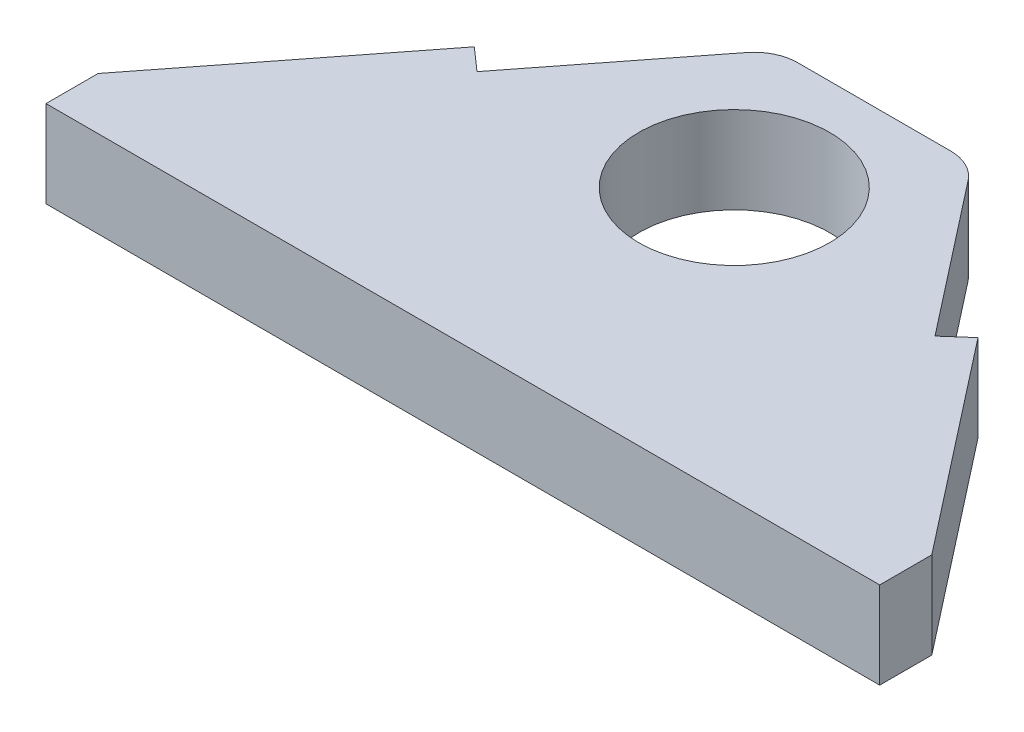
ISO-10303-21;
HEADER;
FILE_DESCRIPTION(('STEP AP214'),'2;1');
FILE_NAME('part.step','',(''),(''),'','','');
FILE_SCHEMA(('AUTOMOTIVE_DESIGN { 1 0 10303 214 1 1 1 1 }'));
ENDSEC;
DATA;
#1=APPLICATION_CONTEXT('core data for automotive mechanical design processes');
#2=APPLICATION_PROTOCOL_DEFINITION('international standard','automotive_design',2000,#1);
#3=PRODUCT_CONTEXT('',#1,'mechanical');
#4=PRODUCT('Part','Part','',(#3));
#5=PRODUCT_RELATED_PRODUCT_CATEGORY('part','',(#4));
#6=PRODUCT_DEFINITION_FORMATION('','',#4);
#7=PRODUCT_DEFINITION_CONTEXT('part definition',#1,'design');
#8=PRODUCT_DEFINITION('design','',#6,#7);
#9=PRODUCT_DEFINITION_SHAPE('','',#8);
#10=(LENGTH_UNIT() NAMED_UNIT(*) SI_UNIT(.MILLI.,.METRE.));
#11=(NAMED_UNIT(*) PLANE_ANGLE_UNIT() SI_UNIT($,.RADIAN.));
#12=(NAMED_UNIT(*) SI_UNIT($,.STERADIAN.) SOLID_ANGLE_UNIT());
#13=UNCERTAINTY_MEASURE_WITH_UNIT(LENGTH_MEASURE(1.E-05),#10,'distance_accuracy_value','');
#14=(GEOMETRIC_REPRESENTATION_CONTEXT(3) GLOBAL_UNCERTAINTY_ASSIGNED_CONTEXT((#13)) GLOBAL_UNIT_ASSIGNED_CONTEXT((#10,
#11,#12)) REPRESENTATION_CONTEXT('',''));
#15=CARTESIAN_POINT('',(0.,0.,0.));
#16=DIRECTION('',(0.,0.,1.));
#17=DIRECTION('',(1.,0.,0.));
#18=AXIS2_PLACEMENT_3D('',#15,#16,#17);
#19=CARTESIAN_POINT('',(17.6162885321092,20.,-22.2139984203571));
#20=DIRECTION('',(0.,-1.,0.));
#21=DIRECTION('',(0.,0.,-1.));
#22=AXIS2_PLACEMENT_3D('',#19,#20,#21);
#23=CYLINDRICAL_SURFACE('',#22,10.);
#24=CARTESIAN_POINT('',(17.6162885321092,0.,-22.2139984203571));
#25=DIRECTION('',(0.,1.,0.));
#26=DIRECTION('',(0.,0.,1.));
#27=AXIS2_PLACEMENT_3D('',#24,#25,#26);
#28=CIRCLE('',#27,10.);
#29=CARTESIAN_POINT('',(17.6162885321092,0.,-32.2139984203571));
#30=VERTEX_POINT('',#29);
#31=CARTESIAN_POINT('',(25.4963960681764,0.,-28.3706131736137));
#32=VERTEX_POINT('',#31);
#33=EDGE_CURVE('E161',#30,#32,#28,.F.);
#34=ORIENTED_EDGE('',*,*,#33,.F.);
#35=DIRECTION('',(0.,-1.,0.));
#36=VECTOR('',#35,1.);
#37=CARTESIAN_POINT('',(17.6162885321092,20.,-32.2139984203571));
#38=LINE('',#37,#36);
#39=CARTESIAN_POINT('',(17.6162885321092,20.,-32.2139984203571));
#40=VERTEX_POINT('',#39);
#41=EDGE_CURVE('E11',#40,#30,#38,.T.);
#42=ORIENTED_EDGE('',*,*,#41,.F.);
#43=CARTESIAN_POINT('',(17.6162885321092,20.,-22.2139984203571));
#44=DIRECTION('',(0.,1.,0.));
#45=DIRECTION('',(0.,0.,1.));
#46=AXIS2_PLACEMENT_3D('',#43,#44,#45);
#47=CIRCLE('',#46,10.);
#48=CARTESIAN_POINT('',(25.4963960681764,20.,-28.3706131736137));
#49=VERTEX_POINT('',#48);
#50=EDGE_CURVE('E193',#40,#49,#47,.F.);
#51=ORIENTED_EDGE('',*,*,#50,.T.);
#52=DIRECTION('',(0.,-1.,0.));
#53=VECTOR('',#52,1.);
#54=CARTESIAN_POINT('',(25.4963960681764,20.,-28.3706131736137));
#55=LINE('',#54,#53);
#56=EDGE_CURVE('E102',#49,#32,#55,.T.);
#57=ORIENTED_EDGE('',*,*,#56,.T.);
#58=EDGE_LOOP('',(#34,#42,#51,#57));
#59=FACE_BOUND('',#58,.T.);
#60=ADVANCED_FACE('F39',(#59),#23,.T.);
#61=CARTESIAN_POINT('',(0.,20.,-32.2139984203571));
#62=DIRECTION('',(0.,0.,1.));
#63=DIRECTION('',(1.,0.,0.));
#64=AXIS2_PLACEMENT_3D('',#61,#62,#63);
#65=PLANE('',#64);
#66=DIRECTION('',(-1.,0.,0.));
#67=VECTOR('',#66,1.);
#68=CARTESIAN_POINT('',(0.,0.,-32.2139984203571));
#69=LINE('',#68,#67);
#70=CARTESIAN_POINT('',(-17.6162885321092,0.,-32.2139984203571));
#71=VERTEX_POINT('',#70);
#72=EDGE_CURVE('E164',#30,#71,#69,.T.);
#73=ORIENTED_EDGE('',*,*,#72,.T.);
#74=DIRECTION('',(0.,-1.,0.));
#75=VECTOR('',#74,1.);
#76=CARTESIAN_POINT('',(-17.6162885321092,20.,-32.2139984203571));
#77=LINE('',#76,#75);
#78=CARTESIAN_POINT('',(-17.6162885321092,20.,-32.2139984203571));
#79=VERTEX_POINT('',#78);
#80=EDGE_CURVE('E47',#79,#71,#77,.T.);
#81=ORIENTED_EDGE('',*,*,#80,.F.);
#82=DIRECTION('',(-1.,0.,0.));
#83=VECTOR('',#82,1.);
#84=CARTESIAN_POINT('',(0.,20.,-32.2139984203571));
#85=LINE('',#84,#83);
#86=EDGE_CURVE('E234',#40,#79,#85,.T.);
#87=ORIENTED_EDGE('',*,*,#86,.F.);
#88=ORIENTED_EDGE('',*,*,#41,.T.);
#89=EDGE_LOOP('',(#73,#81,#87,#88));
#90=FACE_BOUND('',#89,.T.);
#91=ADVANCED_FACE('F266',(#90),#65,.F.);
#92=CARTESIAN_POINT('',(-17.6162885321092,20.,-22.2139984203571));
#93=DIRECTION('',(0.,-1.,0.));
#94=DIRECTION('',(0.,0.,-1.));
#95=AXIS2_PLACEMENT_3D('',#92,#93,#94);
#96=CYLINDRICAL_SURFACE('',#95,10.);
#97=CARTESIAN_POINT('',(-17.6162885321092,0.,-22.2139984203571));
#98=DIRECTION('',(0.,1.,0.));
#99=DIRECTION('',(0.,0.,1.));
#100=AXIS2_PLACEMENT_3D('',#97,#98,#99);
#101=CIRCLE('',#100,10.);
#102=CARTESIAN_POINT('',(-25.4963960681764,0.,-28.3706131736137));
#103=VERTEX_POINT('',#102);
#104=EDGE_CURVE('E166',#71,#103,#101,.T.);
#105=ORIENTED_EDGE('',*,*,#104,.T.);
#106=DIRECTION('',(0.,-1.,0.));
#107=VECTOR('',#106,1.);
#108=CARTESIAN_POINT('',(-25.4963960681764,20.,-28.3706131736137));
#109=LINE('',#108,#107);
#110=CARTESIAN_POINT('',(-25.4963960681764,20.,-28.3706131736137));
#111=VERTEX_POINT('',#110);
#112=EDGE_CURVE('E207',#111,#103,#109,.T.);
#113=ORIENTED_EDGE('',*,*,#112,.F.);
#114=CARTESIAN_POINT('',(-17.6162885321092,20.,-22.2139984203571));
#115=DIRECTION('',(0.,1.,0.));
#116=DIRECTION('',(0.,0.,1.));
#117=AXIS2_PLACEMENT_3D('',#114,#115,#116);
#118=CIRCLE('',#117,10.);
#119=EDGE_CURVE('E215',#79,#111,#118,.T.);
#120=ORIENTED_EDGE('',*,*,#119,.F.);
#121=ORIENTED_EDGE('',*,*,#80,.T.);
#122=EDGE_LOOP('',(#105,#113,#120,#121));
#123=FACE_BOUND('',#122,.T.);
#124=ADVANCED_FACE('F213',(#123),#96,.T.);
#125=CARTESIAN_POINT('',(-29.5962086250682,20.,-23.1230923978599));
#126=DIRECTION('',(-0.788010753606722,0.,-0.615661475325658));
#127=DIRECTION('',(-0.615661475325658,0.,0.788010753606722));
#128=AXIS2_PLACEMENT_3D('',#125,#126,#127);
#129=PLANE('',#128);
#130=DIRECTION('',(0.615661475325658,0.,-0.788010753606722));
#131=VECTOR('',#130,1.);
#132=CARTESIAN_POINT('',(-29.5962086250682,0.,-23.1230923978599));
#133=LINE('',#132,#131);
#134=CARTESIAN_POINT('',(-52.7403049281966,0.,6.50000000000004));
#135=VERTEX_POINT('',#134);
#136=EDGE_CURVE('E169',#135,#103,#133,.T.);
#137=ORIENTED_EDGE('',*,*,#136,.F.);
#138=DIRECTION('',(0.,-1.,0.));
#139=VECTOR('',#138,1.);
#140=CARTESIAN_POINT('',(-52.7403049281966,20.,6.50000000000004));
#141=LINE('',#140,#139);
#142=CARTESIAN_POINT('',(-52.7403049281966,20.,6.50000000000004));
#143=VERTEX_POINT('',#142);
#144=EDGE_CURVE('E205',#143,#135,#141,.T.);
#145=ORIENTED_EDGE('',*,*,#144,.F.);
#146=DIRECTION('',(0.615661475325658,0.,-0.788010753606722));
#147=VECTOR('',#146,1.);
#148=CARTESIAN_POINT('',(-29.5962086250682,20.,-23.1230923978599));
#149=LINE('',#148,#147);
#150=EDGE_CURVE('E227',#143,#111,#149,.T.);
#151=ORIENTED_EDGE('',*,*,#150,.T.);
#152=ORIENTED_EDGE('',*,*,#112,.T.);
#153=EDGE_LOOP('',(#137,#145,#151,#152));
#154=FACE_BOUND('',#153,.T.);
#155=ADVANCED_FACE('F224',(#154),#129,.T.);
#156=CARTESIAN_POINT('',(-26.3149494454446,20.,29.8196141034551));
#157=DIRECTION('',(0.661671473883579,0.,-0.749793878775182));
#158=DIRECTION('',(-0.749793878775182,0.,-0.661671473883579));
#159=AXIS2_PLACEMENT_3D('',#156,#157,#158);
#160=PLANE('',#159);
#161=DIRECTION('',(0.749793878775182,0.,0.661671473883579));
#162=VECTOR('',#161,1.);
#163=CARTESIAN_POINT('',(-26.3149494454446,0.,29.8196141034551));
#164=LINE('',#163,#162);
#165=CARTESIAN_POINT('',(-57.9982671267135,0.,1.86000000000004));
#166=VERTEX_POINT('',#165);
#167=EDGE_CURVE('E172',#166,#135,#164,.T.);
#168=ORIENTED_EDGE('',*,*,#167,.F.);
#169=DIRECTION('',(0.,-1.,0.));
#170=VECTOR('',#169,1.);
#171=CARTESIAN_POINT('',(-57.9982671267135,20.,1.86000000000004));
#172=LINE('',#171,#170);
#173=CARTESIAN_POINT('',(-57.9982671267135,20.,1.86000000000004));
#174=VERTEX_POINT('',#173);
#175=EDGE_CURVE('E203',#174,#166,#172,.T.);
#176=ORIENTED_EDGE('',*,*,#175,.F.);
#177=DIRECTION('',(0.749793878775182,0.,0.661671473883579));
#178=VECTOR('',#177,1.);
#179=CARTESIAN_POINT('',(-26.3149494454446,20.,29.8196141034551));
#180=LINE('',#179,#178);
#181=EDGE_CURVE('E230',#174,#143,#180,.T.);
#182=ORIENTED_EDGE('',*,*,#181,.T.);
#183=ORIENTED_EDGE('',*,*,#144,.T.);
#184=EDGE_LOOP('',(#168,#176,#182,#183));
#185=FACE_BOUND('',#184,.T.);
#186=ADVANCED_FACE('F379',(#185),#160,.T.);
#187=CARTESIAN_POINT('',(-35.1122839003154,20.,-27.4327227251395));
#188=DIRECTION('',(-0.788010753606723,0.,-0.615661475325657));
#189=DIRECTION('',(-0.615661475325657,0.,0.788010753606723));
#190=AXIS2_PLACEMENT_3D('',#187,#188,#189);
#191=PLANE('',#190);
#192=DIRECTION('',(0.615661475325657,0.,-0.788010753606723));
#193=VECTOR('',#192,1.);
#194=CARTESIAN_POINT('',(-35.1122839003154,0.,-27.4327227251395));
#195=LINE('',#194,#193);
#196=CARTESIAN_POINT('',(-96.0000000000001,0.,50.5));
#197=VERTEX_POINT('',#196);
#198=EDGE_CURVE('E175',#197,#166,#195,.T.);
#199=ORIENTED_EDGE('',*,*,#198,.F.);
#200=DIRECTION('',(0.,-1.,0.));
#201=VECTOR('',#200,1.);
#202=CARTESIAN_POINT('',(-96.0000000000001,20.,50.5));
#203=LINE('',#202,#201);
#204=CARTESIAN_POINT('',(-96.0000000000001,20.,50.5));
#205=VERTEX_POINT('',#204);
#206=EDGE_CURVE('E201',#205,#197,#203,.T.);
#207=ORIENTED_EDGE('',*,*,#206,.F.);
#208=DIRECTION('',(0.615661475325657,0.,-0.788010753606723));
#209=VECTOR('',#208,1.);
#210=CARTESIAN_POINT('',(-35.1122839003154,20.,-27.4327227251395));
#211=LINE('',#210,#209);
#212=EDGE_CURVE('E232',#205,#174,#211,.T.);
#213=ORIENTED_EDGE('',*,*,#212,.T.);
#214=ORIENTED_EDGE('',*,*,#175,.T.);
#215=EDGE_LOOP('',(#199,#207,#213,#214));
#216=FACE_BOUND('',#215,.T.);
#217=ADVANCED_FACE('F369',(#216),#191,.T.);
#218=CARTESIAN_POINT('',(-96.0000000000005,20.,7.77156117237615E-13));
#219=DIRECTION('',(-1.,0.,0.));
#220=DIRECTION('',(0.,0.,1.));
#221=AXIS2_PLACEMENT_3D('',#218,#219,#220);
#222=PLANE('',#221);
#223=DIRECTION('',(0.,0.,-1.));
#224=VECTOR('',#223,1.);
#225=CARTESIAN_POINT('',(-96.0000000000005,0.,7.77156117237615E-13));
#226=LINE('',#225,#224);
#227=CARTESIAN_POINT('',(-96.,0.,62.5));
#228=VERTEX_POINT('',#227);
#229=EDGE_CURVE('E178',#228,#197,#226,.T.);
#230=ORIENTED_EDGE('',*,*,#229,.F.);
#231=DIRECTION('',(0.,-1.,0.));
#232=VECTOR('',#231,1.);
#233=CARTESIAN_POINT('',(-96.,20.,62.5));
#234=LINE('',#233,#232);
#235=CARTESIAN_POINT('',(-96.,20.,62.5));
#236=VERTEX_POINT('',#235);
#237=EDGE_CURVE('E199',#236,#228,#234,.T.);
#238=ORIENTED_EDGE('',*,*,#237,.F.);
#239=DIRECTION('',(0.,0.,-1.));
#240=VECTOR('',#239,1.);
#241=CARTESIAN_POINT('',(-96.0000000000005,20.,7.77156117237615E-13));
#242=LINE('',#241,#240);
#243=EDGE_CURVE('E240',#236,#205,#242,.T.);
#244=ORIENTED_EDGE('',*,*,#243,.T.);
#245=ORIENTED_EDGE('',*,*,#206,.T.);
#246=EDGE_LOOP('',(#230,#238,#244,#245));
#247=FACE_BOUND('',#246,.T.);
#248=ADVANCED_FACE('F252',(#247),#222,.T.);
#249=CARTESIAN_POINT('',(0.,20.,62.5));
#250=DIRECTION('',(0.,0.,1.));
#251=DIRECTION('',(1.,0.,0.));
#252=AXIS2_PLACEMENT_3D('',#249,#250,#251);
#253=PLANE('',#252);
#254=DIRECTION('',(-1.,0.,0.));
#255=VECTOR('',#254,1.);
#256=CARTESIAN_POINT('',(0.,0.,62.5));
#257=LINE('',#256,#255);
#258=CARTESIAN_POINT('',(96.,0.,62.5));
#259=VERTEX_POINT('',#258);
#260=EDGE_CURVE('E181',#259,#228,#257,.T.);
#261=ORIENTED_EDGE('',*,*,#260,.F.);
#262=DIRECTION('',(0.,-1.,0.));
#263=VECTOR('',#262,1.);
#264=CARTESIAN_POINT('',(96.,20.,62.5));
#265=LINE('',#264,#263);
#266=CARTESIAN_POINT('',(96.,20.,62.5));
#267=VERTEX_POINT('',#266);
#268=EDGE_CURVE('E197',#267,#259,#265,.T.);
#269=ORIENTED_EDGE('',*,*,#268,.F.);
#270=DIRECTION('',(-1.,0.,0.));
#271=VECTOR('',#270,1.);
#272=CARTESIAN_POINT('',(0.,20.,62.5));
#273=LINE('',#272,#271);
#274=EDGE_CURVE('E243',#267,#236,#273,.T.);
#275=ORIENTED_EDGE('',*,*,#274,.T.);
#276=ORIENTED_EDGE('',*,*,#237,.T.);
#277=EDGE_LOOP('',(#261,#269,#275,#276));
#278=FACE_BOUND('',#277,.T.);
#279=ADVANCED_FACE('F247',(#278),#253,.T.);
#280=CARTESIAN_POINT('',(96.0000000000004,20.,5.5511151231258E-13));
#281=DIRECTION('',(-1.,0.,0.));
#282=DIRECTION('',(0.,0.,1.));
#283=AXIS2_PLACEMENT_3D('',#280,#281,#282);
#284=PLANE('',#283);
#285=DIRECTION('',(0.,0.,-1.));
#286=VECTOR('',#285,1.);
#287=CARTESIAN_POINT('',(96.0000000000004,0.,5.5511151231258E-13));
#288=LINE('',#287,#286);
#289=CARTESIAN_POINT('',(96.0000000000001,0.,50.5));
#290=VERTEX_POINT('',#289);
#291=EDGE_CURVE('E184',#259,#290,#288,.T.);
#292=ORIENTED_EDGE('',*,*,#291,.T.);
#293=DIRECTION('',(0.,-1.,0.));
#294=VECTOR('',#293,1.);
#295=CARTESIAN_POINT('',(96.0000000000001,20.,50.5));
#296=LINE('',#295,#294);
#297=CARTESIAN_POINT('',(96.0000000000001,20.,50.5));
#298=VERTEX_POINT('',#297);
#299=EDGE_CURVE('E150',#298,#290,#296,.T.);
#300=ORIENTED_EDGE('',*,*,#299,.F.);
#301=DIRECTION('',(0.,0.,-1.));
#302=VECTOR('',#301,1.);
#303=CARTESIAN_POINT('',(96.0000000000004,20.,5.5511151231258E-13));
#304=LINE('',#303,#302);
#305=EDGE_CURVE('E141',#267,#298,#304,.T.);
#306=ORIENTED_EDGE('',*,*,#305,.F.);
#307=ORIENTED_EDGE('',*,*,#268,.T.);
#308=EDGE_LOOP('',(#292,#300,#306,#307));
#309=FACE_BOUND('',#308,.T.);
#310=ADVANCED_FACE('F256',(#309),#284,.F.);
#311=CARTESIAN_POINT('',(35.1122839003154,20.,-27.4327227251395));
#312=DIRECTION('',(-0.788010753606723,0.,0.615661475325657));
#313=DIRECTION('',(0.615661475325657,0.,0.788010753606723));
#314=AXIS2_PLACEMENT_3D('',#311,#312,#313);
#315=PLANE('',#314);
#316=DIRECTION('',(-0.615661475325657,0.,-0.788010753606723));
#317=VECTOR('',#316,1.);
#318=CARTESIAN_POINT('',(35.1122839003154,0.,-27.4327227251395));
#319=LINE('',#318,#317);
#320=CARTESIAN_POINT('',(57.9982671267135,0.,1.86000000000002));
#321=VERTEX_POINT('',#320);
#322=EDGE_CURVE('E149',#290,#321,#319,.T.);
#323=ORIENTED_EDGE('',*,*,#322,.T.);
#324=DIRECTION('',(0.,-1.,0.));
#325=VECTOR('',#324,1.);
#326=CARTESIAN_POINT('',(57.9982671267135,20.,1.86000000000002));
#327=LINE('',#326,#325);
#328=CARTESIAN_POINT('',(57.9982671267135,20.,1.86000000000002));
#329=VERTEX_POINT('',#328);
#330=EDGE_CURVE('E146',#329,#321,#327,.T.);
#331=ORIENTED_EDGE('',*,*,#330,.F.);
#332=DIRECTION('',(-0.615661475325657,0.,-0.788010753606723));
#333=VECTOR('',#332,1.);
#334=CARTESIAN_POINT('',(35.1122839003154,20.,-27.4327227251395));
#335=LINE('',#334,#333);
#336=EDGE_CURVE('E133',#298,#329,#335,.T.);
#337=ORIENTED_EDGE('',*,*,#336,.F.);
#338=ORIENTED_EDGE('',*,*,#299,.T.);
#339=EDGE_LOOP('',(#323,#331,#337,#338));
#340=FACE_BOUND('',#339,.T.);
#341=ADVANCED_FACE('F147',(#340),#315,.F.);
#342=CARTESIAN_POINT('',(26.3149494454447,20.,29.8196141034551));
#343=DIRECTION('',(0.661671473883581,0.,0.74979387877518));
#344=DIRECTION('',(0.74979387877518,0.,-0.661671473883581));
#345=AXIS2_PLACEMENT_3D('',#342,#343,#344);
#346=PLANE('',#345);
#347=DIRECTION('',(-0.74979387877518,0.,0.661671473883581));
#348=VECTOR('',#347,1.);
#349=CARTESIAN_POINT('',(26.3149494454447,0.,29.8196141034551));
#350=LINE('',#349,#348);
#351=CARTESIAN_POINT('',(52.7403049281966,0.,6.50000000000002));
#352=VERTEX_POINT('',#351);
#353=EDGE_CURVE('E95',#321,#352,#350,.T.);
#354=ORIENTED_EDGE('',*,*,#353,.T.);
#355=DIRECTION('',(0.,-1.,0.));
#356=VECTOR('',#355,1.);
#357=CARTESIAN_POINT('',(52.7403049281966,20.,6.50000000000002));
#358=LINE('',#357,#356);
#359=CARTESIAN_POINT('',(52.7403049281966,20.,6.50000000000002));
#360=VERTEX_POINT('',#359);
#361=EDGE_CURVE('E151',#360,#352,#358,.T.);
#362=ORIENTED_EDGE('',*,*,#361,.F.);
#363=DIRECTION('',(-0.74979387877518,0.,0.661671473883581));
#364=VECTOR('',#363,1.);
#365=CARTESIAN_POINT('',(26.3149494454447,20.,29.8196141034551));
#366=LINE('',#365,#364);
#367=EDGE_CURVE('E138',#329,#360,#366,.T.);
#368=ORIENTED_EDGE('',*,*,#367,.F.);
#369=ORIENTED_EDGE('',*,*,#330,.T.);
#370=EDGE_LOOP('',(#354,#362,#368,#369));
#371=FACE_BOUND('',#370,.T.);
#372=ADVANCED_FACE('F153',(#371),#346,.F.);
#373=CARTESIAN_POINT('',(29.5962086250682,20.,-23.1230923978599));
#374=DIRECTION('',(-0.788010753606722,0.,0.615661475325658));
#375=DIRECTION('',(0.615661475325658,0.,0.788010753606722));
#376=AXIS2_PLACEMENT_3D('',#373,#374,#375);
#377=PLANE('',#376);
#378=DIRECTION('',(-0.615661475325658,0.,-0.788010753606722));
#379=VECTOR('',#378,1.);
#380=CARTESIAN_POINT('',(29.5962086250682,0.,-23.1230923978599));
#381=LINE('',#380,#379);
#382=EDGE_CURVE('E188',#352,#32,#381,.T.);
#383=ORIENTED_EDGE('',*,*,#382,.T.);
#384=ORIENTED_EDGE('',*,*,#56,.F.);
#385=DIRECTION('',(-0.615661475325658,0.,-0.788010753606722));
#386=VECTOR('',#385,1.);
#387=CARTESIAN_POINT('',(29.5962086250682,20.,-23.1230923978599));
#388=LINE('',#387,#386);
#389=EDGE_CURVE('E55',#360,#49,#388,.T.);
#390=ORIENTED_EDGE('',*,*,#389,.F.);
#391=ORIENTED_EDGE('',*,*,#361,.T.);
#392=EDGE_LOOP('',(#383,#384,#390,#391));
#393=FACE_BOUND('',#392,.T.);
#394=ADVANCED_FACE('F272',(#393),#377,.F.);
#395=CARTESIAN_POINT('',(0.,20.,0.));
#396=DIRECTION('',(0.,-1.,0.));
#397=DIRECTION('',(0.,0.,-1.));
#398=AXIS2_PLACEMENT_3D('',#395,#396,#397);
#399=CYLINDRICAL_SURFACE('',#398,22.);
#400=CARTESIAN_POINT('',(0.,20.,0.));
#401=DIRECTION('',(0.,1.,0.));
#402=DIRECTION('',(0.,0.,1.));
#403=AXIS2_PLACEMENT_3D('',#400,#401,#402);
#404=CIRCLE('',#403,22.);
#405=CARTESIAN_POINT('',(0.,20.,22.));
#406=VERTEX_POINT('',#405);
#407=EDGE_CURVE('E155',#406,#406,#404,.T.);
#408=ORIENTED_EDGE('',*,*,#407,.T.);
#409=EDGE_LOOP('',(#408));
#410=FACE_BOUND('',#409,.T.);
#411=CARTESIAN_POINT('',(0.,0.,0.));
#412=DIRECTION('',(0.,1.,0.));
#413=DIRECTION('',(0.,0.,1.));
#414=AXIS2_PLACEMENT_3D('',#411,#412,#413);
#415=CIRCLE('',#414,22.);
#416=CARTESIAN_POINT('',(0.,0.,22.));
#417=VERTEX_POINT('',#416);
#418=EDGE_CURVE('E190',#417,#417,#415,.T.);
#419=ORIENTED_EDGE('',*,*,#418,.F.);
#420=EDGE_LOOP('',(#419));
#421=FACE_BOUND('',#420,.T.);
#422=ADVANCED_FACE('F275',(#410,#421),#399,.F.);
#423=CARTESIAN_POINT('',(0.,20.,0.));
#424=DIRECTION('',(0.,1.,0.));
#425=DIRECTION('',(0.,0.,1.));
#426=AXIS2_PLACEMENT_3D('',#423,#424,#425);
#427=PLANE('',#426);
#428=ORIENTED_EDGE('',*,*,#50,.F.);
#429=ORIENTED_EDGE('',*,*,#86,.T.);
#430=ORIENTED_EDGE('',*,*,#119,.T.);
#431=ORIENTED_EDGE('',*,*,#150,.F.);
#432=ORIENTED_EDGE('',*,*,#181,.F.);
#433=ORIENTED_EDGE('',*,*,#212,.F.);
#434=ORIENTED_EDGE('',*,*,#243,.F.);
#435=ORIENTED_EDGE('',*,*,#274,.F.);
#436=ORIENTED_EDGE('',*,*,#305,.T.);
#437=ORIENTED_EDGE('',*,*,#336,.T.);
#438=ORIENTED_EDGE('',*,*,#367,.T.);
#439=ORIENTED_EDGE('',*,*,#389,.T.);
#440=EDGE_LOOP('',(#428,#429,#430,#431,#432,#433,#434,#435,#436,#437,#438,#439));
#441=FACE_BOUND('',#440,.T.);
#442=ORIENTED_EDGE('',*,*,#407,.F.);
#443=EDGE_LOOP('',(#442));
#444=FACE_BOUND('',#443,.T.);
#445=ADVANCED_FACE('F135',(#441,#444),#427,.T.);
#446=CARTESIAN_POINT('',(0.,0.,0.));
#447=DIRECTION('',(0.,1.,0.));
#448=DIRECTION('',(0.,0.,1.));
#449=AXIS2_PLACEMENT_3D('',#446,#447,#448);
#450=PLANE('',#449);
#451=ORIENTED_EDGE('',*,*,#33,.T.);
#452=ORIENTED_EDGE('',*,*,#382,.F.);
#453=ORIENTED_EDGE('',*,*,#353,.F.);
#454=ORIENTED_EDGE('',*,*,#322,.F.);
#455=ORIENTED_EDGE('',*,*,#291,.F.);
#456=ORIENTED_EDGE('',*,*,#260,.T.);
#457=ORIENTED_EDGE('',*,*,#229,.T.);
#458=ORIENTED_EDGE('',*,*,#198,.T.);
#459=ORIENTED_EDGE('',*,*,#167,.T.);
#460=ORIENTED_EDGE('',*,*,#136,.T.);
#461=ORIENTED_EDGE('',*,*,#104,.F.);
#462=ORIENTED_EDGE('',*,*,#72,.F.);
#463=EDGE_LOOP('',(#451,#452,#453,#454,#455,#456,#457,#458,#459,#460,#461,#462));
#464=FACE_BOUND('',#463,.T.);
#465=ORIENTED_EDGE('',*,*,#418,.T.);
#466=EDGE_LOOP('',(#465));
#467=FACE_BOUND('',#466,.T.);
#468=ADVANCED_FACE('F219',(#464,#467),#450,.F.);
#469=CLOSED_SHELL('',(#60,#91,#124,#155,#186,#217,#248,#279,#310,#341,#372,#394,#422,#445,#468));
#470=MANIFOLD_SOLID_BREP('B2',#469);
#471=ADVANCED_BREP_SHAPE_REPRESENTATION('',(#18,#470),#14);
#472=SHAPE_DEFINITION_REPRESENTATION(#9,#471);
ENDSEC;
END-ISO-10303-21;
